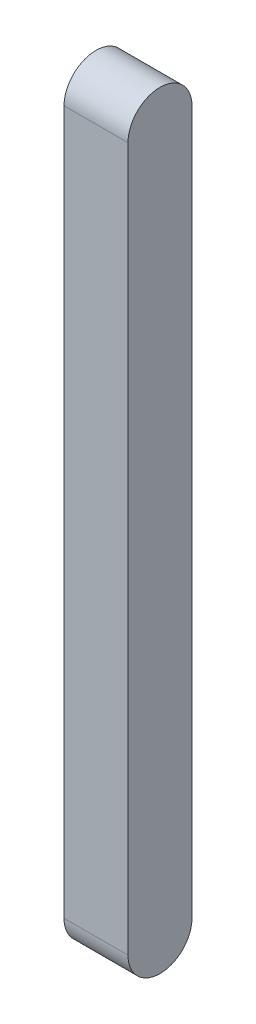
ISO-10303-21;
HEADER;
FILE_DESCRIPTION(('STEP AP214'),'2;1');
FILE_NAME('part.step','',(''),(''),'','','');
FILE_SCHEMA(('AUTOMOTIVE_DESIGN { 1 0 10303 214 1 1 1 1 }'));
ENDSEC;
DATA;
#1=APPLICATION_CONTEXT('core data for automotive mechanical design processes');
#2=APPLICATION_PROTOCOL_DEFINITION('international standard','automotive_design',2000,#1);
#3=PRODUCT_CONTEXT('',#1,'mechanical');
#4=PRODUCT('Part','Part','',(#3));
#5=PRODUCT_RELATED_PRODUCT_CATEGORY('part','',(#4));
#6=PRODUCT_DEFINITION_FORMATION('','',#4);
#7=PRODUCT_DEFINITION_CONTEXT('part definition',#1,'design');
#8=PRODUCT_DEFINITION('design','',#6,#7);
#9=PRODUCT_DEFINITION_SHAPE('','',#8);
#10=(LENGTH_UNIT() NAMED_UNIT(*) SI_UNIT(.MILLI.,.METRE.));
#11=(NAMED_UNIT(*) PLANE_ANGLE_UNIT() SI_UNIT($,.RADIAN.));
#12=(NAMED_UNIT(*) SI_UNIT($,.STERADIAN.) SOLID_ANGLE_UNIT());
#13=UNCERTAINTY_MEASURE_WITH_UNIT(LENGTH_MEASURE(1.E-05),#10,'distance_accuracy_value','');
#14=(GEOMETRIC_REPRESENTATION_CONTEXT(3) GLOBAL_UNCERTAINTY_ASSIGNED_CONTEXT((#13)) GLOBAL_UNIT_ASSIGNED_CONTEXT((#10,
#11,#12)) REPRESENTATION_CONTEXT('',''));
#15=CARTESIAN_POINT('',(0.,0.,0.));
#16=DIRECTION('',(0.,0.,1.));
#17=DIRECTION('',(1.,0.,0.));
#18=AXIS2_PLACEMENT_3D('',#15,#16,#17);
#19=CARTESIAN_POINT('',(0.,55.,0.));
#20=DIRECTION('',(1.,0.,0.));
#21=DIRECTION('',(0.,0.,-1.));
#22=AXIS2_PLACEMENT_3D('',#19,#20,#21);
#23=PLANE('',#22);
#24=CARTESIAN_POINT('',(0.,55.,0.));
#25=DIRECTION('',(1.,0.,0.));
#26=DIRECTION('',(0.,0.,-1.));
#27=AXIS2_PLACEMENT_3D('',#24,#25,#26);
#28=CIRCLE('',#27,5.);
#29=CARTESIAN_POINT('',(0.,55.,-5.));
#30=VERTEX_POINT('',#29);
#31=CARTESIAN_POINT('',(0.,55.,5.));
#32=VERTEX_POINT('',#31);
#33=EDGE_CURVE('E113',#30,#32,#28,.T.);
#34=ORIENTED_EDGE('',*,*,#33,.F.);
#35=DIRECTION('',(0.,-1.,0.));
#36=VECTOR('',#35,1.);
#37=CARTESIAN_POINT('',(0.,55.,-5.));
#38=LINE('',#37,#36);
#39=CARTESIAN_POINT('',(0.,-55.,-5.00000000000001));
#40=VERTEX_POINT('',#39);
#41=EDGE_CURVE('E119',#30,#40,#38,.T.);
#42=ORIENTED_EDGE('',*,*,#41,.T.);
#43=CARTESIAN_POINT('',(0.,-55.,0.));
#44=DIRECTION('',(1.,0.,0.));
#45=DIRECTION('',(0.,0.,-1.));
#46=AXIS2_PLACEMENT_3D('',#43,#44,#45);
#47=CIRCLE('',#46,5.);
#48=CARTESIAN_POINT('',(0.,-55.,4.99999999999999));
#49=VERTEX_POINT('',#48);
#50=EDGE_CURVE('E69',#49,#40,#47,.T.);
#51=ORIENTED_EDGE('',*,*,#50,.F.);
#52=DIRECTION('',(0.,-1.,0.));
#53=VECTOR('',#52,1.);
#54=CARTESIAN_POINT('',(0.,55.,5.));
#55=LINE('',#54,#53);
#56=EDGE_CURVE('E118',#32,#49,#55,.T.);
#57=ORIENTED_EDGE('',*,*,#56,.F.);
#58=EDGE_LOOP('',(#34,#42,#51,#57));
#59=FACE_BOUND('',#58,.T.);
#60=ADVANCED_FACE('F65',(#59),#23,.F.);
#61=CARTESIAN_POINT('',(10.,55.,0.));
#62=DIRECTION('',(1.,0.,0.));
#63=DIRECTION('',(0.,0.,-1.));
#64=AXIS2_PLACEMENT_3D('',#61,#62,#63);
#65=PLANE('',#64);
#66=CARTESIAN_POINT('',(10.,55.,0.));
#67=DIRECTION('',(1.,0.,0.));
#68=DIRECTION('',(0.,0.,-1.));
#69=AXIS2_PLACEMENT_3D('',#66,#67,#68);
#70=CIRCLE('',#69,5.);
#71=CARTESIAN_POINT('',(10.,55.,-5.));
#72=VERTEX_POINT('',#71);
#73=CARTESIAN_POINT('',(10.,55.,5.));
#74=VERTEX_POINT('',#73);
#75=EDGE_CURVE('E134',#72,#74,#70,.T.);
#76=ORIENTED_EDGE('',*,*,#75,.T.);
#77=DIRECTION('',(0.,-1.,0.));
#78=VECTOR('',#77,1.);
#79=CARTESIAN_POINT('',(10.,55.,5.));
#80=LINE('',#79,#78);
#81=CARTESIAN_POINT('',(10.,-55.,4.99999999999999));
#82=VERTEX_POINT('',#81);
#83=EDGE_CURVE('E123',#74,#82,#80,.T.);
#84=ORIENTED_EDGE('',*,*,#83,.T.);
#85=CARTESIAN_POINT('',(10.,-55.,0.));
#86=DIRECTION('',(1.,0.,0.));
#87=DIRECTION('',(0.,0.,-1.));
#88=AXIS2_PLACEMENT_3D('',#85,#86,#87);
#89=CIRCLE('',#88,5.);
#90=CARTESIAN_POINT('',(10.,-55.,-5.00000000000001));
#91=VERTEX_POINT('',#90);
#92=EDGE_CURVE('E109',#82,#91,#89,.T.);
#93=ORIENTED_EDGE('',*,*,#92,.T.);
#94=DIRECTION('',(0.,-1.,0.));
#95=VECTOR('',#94,1.);
#96=CARTESIAN_POINT('',(10.,55.,-5.));
#97=LINE('',#96,#95);
#98=EDGE_CURVE('E121',#72,#91,#97,.T.);
#99=ORIENTED_EDGE('',*,*,#98,.F.);
#100=EDGE_LOOP('',(#76,#84,#93,#99));
#101=FACE_BOUND('',#100,.T.);
#102=ADVANCED_FACE('F131',(#101),#65,.T.);
#103=CARTESIAN_POINT('',(10.,55.,0.));
#104=DIRECTION('',(-1.,0.,0.));
#105=DIRECTION('',(0.,0.,1.));
#106=AXIS2_PLACEMENT_3D('',#103,#104,#105);
#107=CYLINDRICAL_SURFACE('',#106,5.);
#108=DIRECTION('',(-1.,0.,0.));
#109=VECTOR('',#108,1.);
#110=CARTESIAN_POINT('',(10.,55.,5.));
#111=LINE('',#110,#109);
#112=EDGE_CURVE('E12',#74,#32,#111,.T.);
#113=ORIENTED_EDGE('',*,*,#112,.F.);
#114=ORIENTED_EDGE('',*,*,#75,.F.);
#115=DIRECTION('',(-1.,0.,0.));
#116=VECTOR('',#115,1.);
#117=CARTESIAN_POINT('',(10.,55.,-5.));
#118=LINE('',#117,#116);
#119=EDGE_CURVE('E75',#72,#30,#118,.T.);
#120=ORIENTED_EDGE('',*,*,#119,.T.);
#121=ORIENTED_EDGE('',*,*,#33,.T.);
#122=EDGE_LOOP('',(#113,#114,#120,#121));
#123=FACE_BOUND('',#122,.T.);
#124=ADVANCED_FACE('F138',(#123),#107,.T.);
#125=CARTESIAN_POINT('',(10.,-55.,0.));
#126=DIRECTION('',(-1.,0.,0.));
#127=DIRECTION('',(0.,0.,1.));
#128=AXIS2_PLACEMENT_3D('',#125,#126,#127);
#129=CYLINDRICAL_SURFACE('',#128,5.);
#130=ORIENTED_EDGE('',*,*,#92,.F.);
#131=DIRECTION('',(-1.,0.,0.));
#132=VECTOR('',#131,1.);
#133=CARTESIAN_POINT('',(10.,-55.,4.99999999999999));
#134=LINE('',#133,#132);
#135=EDGE_CURVE('E105',#82,#49,#134,.T.);
#136=ORIENTED_EDGE('',*,*,#135,.T.);
#137=ORIENTED_EDGE('',*,*,#50,.T.);
#138=DIRECTION('',(-1.,0.,0.));
#139=VECTOR('',#138,1.);
#140=CARTESIAN_POINT('',(10.,-55.,-5.00000000000001));
#141=LINE('',#140,#139);
#142=EDGE_CURVE('E100',#91,#40,#141,.T.);
#143=ORIENTED_EDGE('',*,*,#142,.F.);
#144=EDGE_LOOP('',(#130,#136,#137,#143));
#145=FACE_BOUND('',#144,.T.);
#146=ADVANCED_FACE('F67',(#145),#129,.T.);
#147=CARTESIAN_POINT('',(10.,55.,-5.));
#148=DIRECTION('',(0.,0.,-1.));
#149=DIRECTION('',(0.,1.,0.));
#150=AXIS2_PLACEMENT_3D('',#147,#148,#149);
#151=PLANE('',#150);
#152=ORIENTED_EDGE('',*,*,#41,.F.);
#153=ORIENTED_EDGE('',*,*,#119,.F.);
#154=ORIENTED_EDGE('',*,*,#98,.T.);
#155=ORIENTED_EDGE('',*,*,#142,.T.);
#156=EDGE_LOOP('',(#152,#153,#154,#155));
#157=FACE_BOUND('',#156,.T.);
#158=ADVANCED_FACE('F132',(#157),#151,.T.);
#159=CARTESIAN_POINT('',(10.,55.,5.));
#160=DIRECTION('',(0.,0.,-1.));
#161=DIRECTION('',(0.,1.,0.));
#162=AXIS2_PLACEMENT_3D('',#159,#160,#161);
#163=PLANE('',#162);
#164=ORIENTED_EDGE('',*,*,#56,.T.);
#165=ORIENTED_EDGE('',*,*,#135,.F.);
#166=ORIENTED_EDGE('',*,*,#83,.F.);
#167=ORIENTED_EDGE('',*,*,#112,.T.);
#168=EDGE_LOOP('',(#164,#165,#166,#167));
#169=FACE_BOUND('',#168,.T.);
#170=ADVANCED_FACE('F120',(#169),#163,.F.);
#171=CLOSED_SHELL('',(#60,#102,#124,#146,#158,#170));
#172=MANIFOLD_SOLID_BREP('B2',#171);
#173=ADVANCED_BREP_SHAPE_REPRESENTATION('',(#18,#172),#14);
#174=SHAPE_DEFINITION_REPRESENTATION(#9,#173);
ENDSEC;
END-ISO-10303-21;
